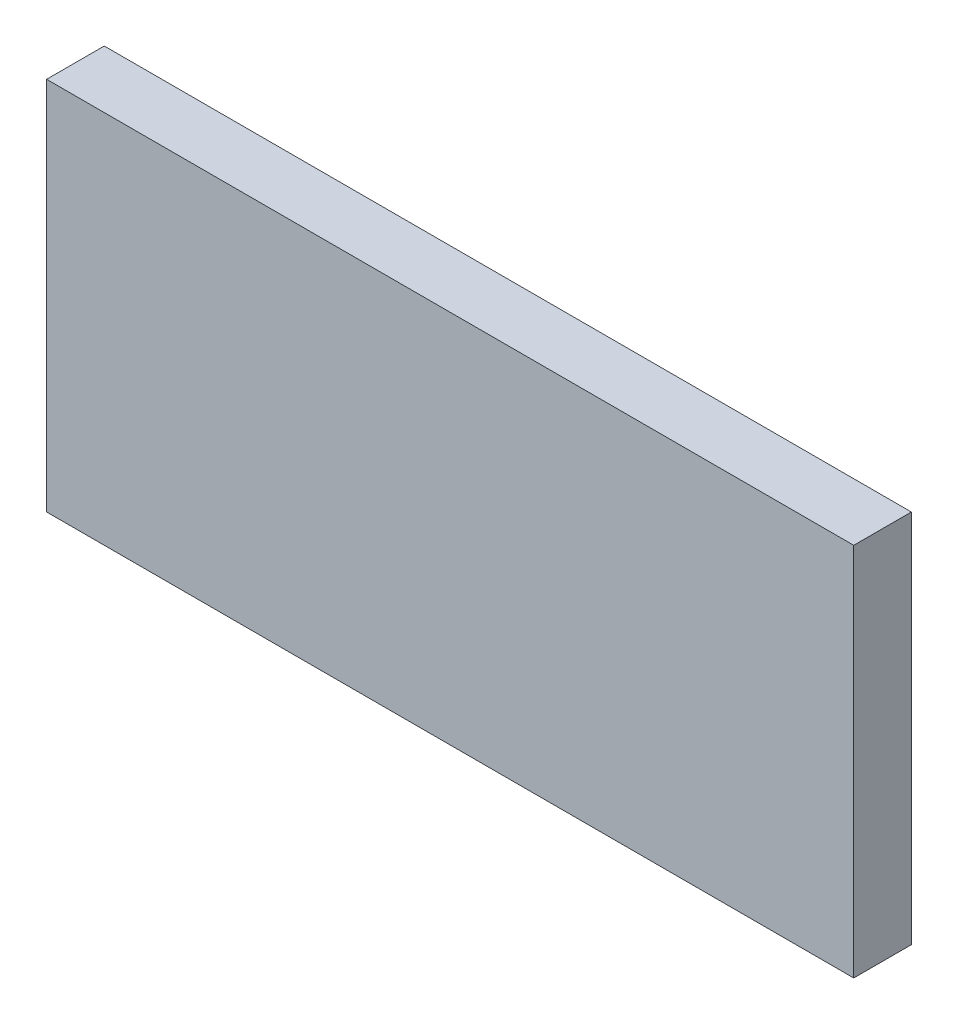
ISO-10303-21;
HEADER;
FILE_DESCRIPTION(('STEP AP214'),'2;1');
FILE_NAME('part.step','',(''),(''),'','','');
FILE_SCHEMA(('AUTOMOTIVE_DESIGN { 1 0 10303 214 1 1 1 1 }'));
ENDSEC;
DATA;
#1=APPLICATION_CONTEXT('core data for automotive mechanical design processes');
#2=APPLICATION_PROTOCOL_DEFINITION('international standard','automotive_design',2000,#1);
#3=PRODUCT_CONTEXT('',#1,'mechanical');
#4=PRODUCT('Part','Part','',(#3));
#5=PRODUCT_RELATED_PRODUCT_CATEGORY('part','',(#4));
#6=PRODUCT_DEFINITION_FORMATION('','',#4);
#7=PRODUCT_DEFINITION_CONTEXT('part definition',#1,'design');
#8=PRODUCT_DEFINITION('design','',#6,#7);
#9=PRODUCT_DEFINITION_SHAPE('','',#8);
#10=(LENGTH_UNIT() NAMED_UNIT(*) SI_UNIT(.MILLI.,.METRE.));
#11=(NAMED_UNIT(*) PLANE_ANGLE_UNIT() SI_UNIT($,.RADIAN.));
#12=(NAMED_UNIT(*) SI_UNIT($,.STERADIAN.) SOLID_ANGLE_UNIT());
#13=UNCERTAINTY_MEASURE_WITH_UNIT(LENGTH_MEASURE(1.E-05),#10,'distance_accuracy_value','');
#14=(GEOMETRIC_REPRESENTATION_CONTEXT(3) GLOBAL_UNCERTAINTY_ASSIGNED_CONTEXT((#13)) GLOBAL_UNIT_ASSIGNED_CONTEXT((#10,
#11,#12)) REPRESENTATION_CONTEXT('',''));
#15=CARTESIAN_POINT('',(0.,0.,0.));
#16=DIRECTION('',(0.,0.,1.));
#17=DIRECTION('',(1.,0.,0.));
#18=AXIS2_PLACEMENT_3D('',#15,#16,#17);
#19=CARTESIAN_POINT('',(88.9,41.275,12.7));
#20=DIRECTION('',(-1.,0.,0.));
#21=DIRECTION('',(0.,0.,1.));
#22=AXIS2_PLACEMENT_3D('',#19,#20,#21);
#23=PLANE('',#22);
#24=DIRECTION('',(0.,1.,0.));
#25=VECTOR('',#24,1.);
#26=CARTESIAN_POINT('',(88.9,41.275,0.));
#27=LINE('',#26,#25);
#28=CARTESIAN_POINT('',(88.9,-41.275,0.));
#29=VERTEX_POINT('',#28);
#30=CARTESIAN_POINT('',(88.9,41.275,0.));
#31=VERTEX_POINT('',#30);
#32=EDGE_CURVE('E99',#29,#31,#27,.T.);
#33=ORIENTED_EDGE('',*,*,#32,.T.);
#34=DIRECTION('',(0.,0.,-1.));
#35=VECTOR('',#34,1.);
#36=CARTESIAN_POINT('',(88.9,41.275,12.7));
#37=LINE('',#36,#35);
#38=CARTESIAN_POINT('',(88.9,41.275,12.7));
#39=VERTEX_POINT('',#38);
#40=EDGE_CURVE('E11',#39,#31,#37,.T.);
#41=ORIENTED_EDGE('',*,*,#40,.F.);
#42=DIRECTION('',(0.,1.,0.));
#43=VECTOR('',#42,1.);
#44=CARTESIAN_POINT('',(88.9,41.275,12.7));
#45=LINE('',#44,#43);
#46=CARTESIAN_POINT('',(88.9,-41.275,12.7));
#47=VERTEX_POINT('',#46);
#48=EDGE_CURVE('E87',#47,#39,#45,.T.);
#49=ORIENTED_EDGE('',*,*,#48,.F.);
#50=DIRECTION('',(0.,0.,-1.));
#51=VECTOR('',#50,1.);
#52=CARTESIAN_POINT('',(88.9,-41.275,12.7));
#53=LINE('',#52,#51);
#54=EDGE_CURVE('E95',#47,#29,#53,.T.);
#55=ORIENTED_EDGE('',*,*,#54,.T.);
#56=EDGE_LOOP('',(#33,#41,#49,#55));
#57=FACE_BOUND('',#56,.T.);
#58=ADVANCED_FACE('F36',(#57),#23,.F.);
#59=CARTESIAN_POINT('',(-88.9,41.275,12.7));
#60=DIRECTION('',(0.,-1.,0.));
#61=DIRECTION('',(0.,0.,-1.));
#62=AXIS2_PLACEMENT_3D('',#59,#60,#61);
#63=PLANE('',#62);
#64=DIRECTION('',(-1.,0.,0.));
#65=VECTOR('',#64,1.);
#66=CARTESIAN_POINT('',(-88.9,41.275,0.));
#67=LINE('',#66,#65);
#68=CARTESIAN_POINT('',(-88.9,41.275,0.));
#69=VERTEX_POINT('',#68);
#70=EDGE_CURVE('E91',#31,#69,#67,.T.);
#71=ORIENTED_EDGE('',*,*,#70,.T.);
#72=DIRECTION('',(0.,0.,-1.));
#73=VECTOR('',#72,1.);
#74=CARTESIAN_POINT('',(-88.9,41.275,12.7));
#75=LINE('',#74,#73);
#76=CARTESIAN_POINT('',(-88.9,41.275,12.7));
#77=VERTEX_POINT('',#76);
#78=EDGE_CURVE('E44',#77,#69,#75,.T.);
#79=ORIENTED_EDGE('',*,*,#78,.F.);
#80=DIRECTION('',(-1.,0.,0.));
#81=VECTOR('',#80,1.);
#82=CARTESIAN_POINT('',(-88.9,41.275,12.7));
#83=LINE('',#82,#81);
#84=EDGE_CURVE('E82',#39,#77,#83,.T.);
#85=ORIENTED_EDGE('',*,*,#84,.F.);
#86=ORIENTED_EDGE('',*,*,#40,.T.);
#87=EDGE_LOOP('',(#71,#79,#85,#86));
#88=FACE_BOUND('',#87,.T.);
#89=ADVANCED_FACE('F90',(#88),#63,.F.);
#90=CARTESIAN_POINT('',(-88.9,41.275,12.7));
#91=DIRECTION('',(1.,0.,0.));
#92=DIRECTION('',(0.,0.,-1.));
#93=AXIS2_PLACEMENT_3D('',#90,#91,#92);
#94=PLANE('',#93);
#95=DIRECTION('',(0.,-1.,0.));
#96=VECTOR('',#95,1.);
#97=CARTESIAN_POINT('',(-88.9,41.275,0.));
#98=LINE('',#97,#96);
#99=CARTESIAN_POINT('',(-88.9,-41.275,0.));
#100=VERTEX_POINT('',#99);
#101=EDGE_CURVE('E69',#69,#100,#98,.T.);
#102=ORIENTED_EDGE('',*,*,#101,.T.);
#103=DIRECTION('',(0.,0.,-1.));
#104=VECTOR('',#103,1.);
#105=CARTESIAN_POINT('',(-88.9,-41.275,12.7));
#106=LINE('',#105,#104);
#107=CARTESIAN_POINT('',(-88.9,-41.275,12.7));
#108=VERTEX_POINT('',#107);
#109=EDGE_CURVE('E92',#108,#100,#106,.T.);
#110=ORIENTED_EDGE('',*,*,#109,.F.);
#111=DIRECTION('',(0.,-1.,0.));
#112=VECTOR('',#111,1.);
#113=CARTESIAN_POINT('',(-88.9,41.275,12.7));
#114=LINE('',#113,#112);
#115=EDGE_CURVE('E85',#77,#108,#114,.T.);
#116=ORIENTED_EDGE('',*,*,#115,.F.);
#117=ORIENTED_EDGE('',*,*,#78,.T.);
#118=EDGE_LOOP('',(#102,#110,#116,#117));
#119=FACE_BOUND('',#118,.T.);
#120=ADVANCED_FACE('F93',(#119),#94,.F.);
#121=CARTESIAN_POINT('',(-88.9,-41.275,12.7));
#122=DIRECTION('',(0.,1.,0.));
#123=DIRECTION('',(0.,0.,1.));
#124=AXIS2_PLACEMENT_3D('',#121,#122,#123);
#125=PLANE('',#124);
#126=DIRECTION('',(1.,0.,0.));
#127=VECTOR('',#126,1.);
#128=CARTESIAN_POINT('',(-88.9,-41.275,0.));
#129=LINE('',#128,#127);
#130=EDGE_CURVE('E75',#100,#29,#129,.T.);
#131=ORIENTED_EDGE('',*,*,#130,.T.);
#132=ORIENTED_EDGE('',*,*,#54,.F.);
#133=DIRECTION('',(1.,0.,0.));
#134=VECTOR('',#133,1.);
#135=CARTESIAN_POINT('',(-88.9,-41.275,12.7));
#136=LINE('',#135,#134);
#137=EDGE_CURVE('E52',#108,#47,#136,.T.);
#138=ORIENTED_EDGE('',*,*,#137,.F.);
#139=ORIENTED_EDGE('',*,*,#109,.T.);
#140=EDGE_LOOP('',(#131,#132,#138,#139));
#141=FACE_BOUND('',#140,.T.);
#142=ADVANCED_FACE('F106',(#141),#125,.F.);
#143=CARTESIAN_POINT('',(0.,0.,12.7));
#144=DIRECTION('',(0.,0.,1.));
#145=DIRECTION('',(1.,0.,0.));
#146=AXIS2_PLACEMENT_3D('',#143,#144,#145);
#147=PLANE('',#146);
#148=ORIENTED_EDGE('',*,*,#48,.T.);
#149=ORIENTED_EDGE('',*,*,#84,.T.);
#150=ORIENTED_EDGE('',*,*,#115,.T.);
#151=ORIENTED_EDGE('',*,*,#137,.T.);
#152=EDGE_LOOP('',(#148,#149,#150,#151));
#153=FACE_BOUND('',#152,.T.);
#154=ADVANCED_FACE('F83',(#153),#147,.T.);
#155=CARTESIAN_POINT('',(0.,0.,0.));
#156=DIRECTION('',(0.,0.,1.));
#157=DIRECTION('',(1.,0.,0.));
#158=AXIS2_PLACEMENT_3D('',#155,#156,#157);
#159=PLANE('',#158);
#160=ORIENTED_EDGE('',*,*,#32,.F.);
#161=ORIENTED_EDGE('',*,*,#130,.F.);
#162=ORIENTED_EDGE('',*,*,#101,.F.);
#163=ORIENTED_EDGE('',*,*,#70,.F.);
#164=EDGE_LOOP('',(#160,#161,#162,#163));
#165=FACE_BOUND('',#164,.T.);
#166=ADVANCED_FACE('F109',(#165),#159,.F.);
#167=CLOSED_SHELL('',(#58,#89,#120,#142,#154,#166));
#168=MANIFOLD_SOLID_BREP('B2',#167);
#169=ADVANCED_BREP_SHAPE_REPRESENTATION('',(#18,#168),#14);
#170=SHAPE_DEFINITION_REPRESENTATION(#9,#169);
ENDSEC;
END-ISO-10303-21;
